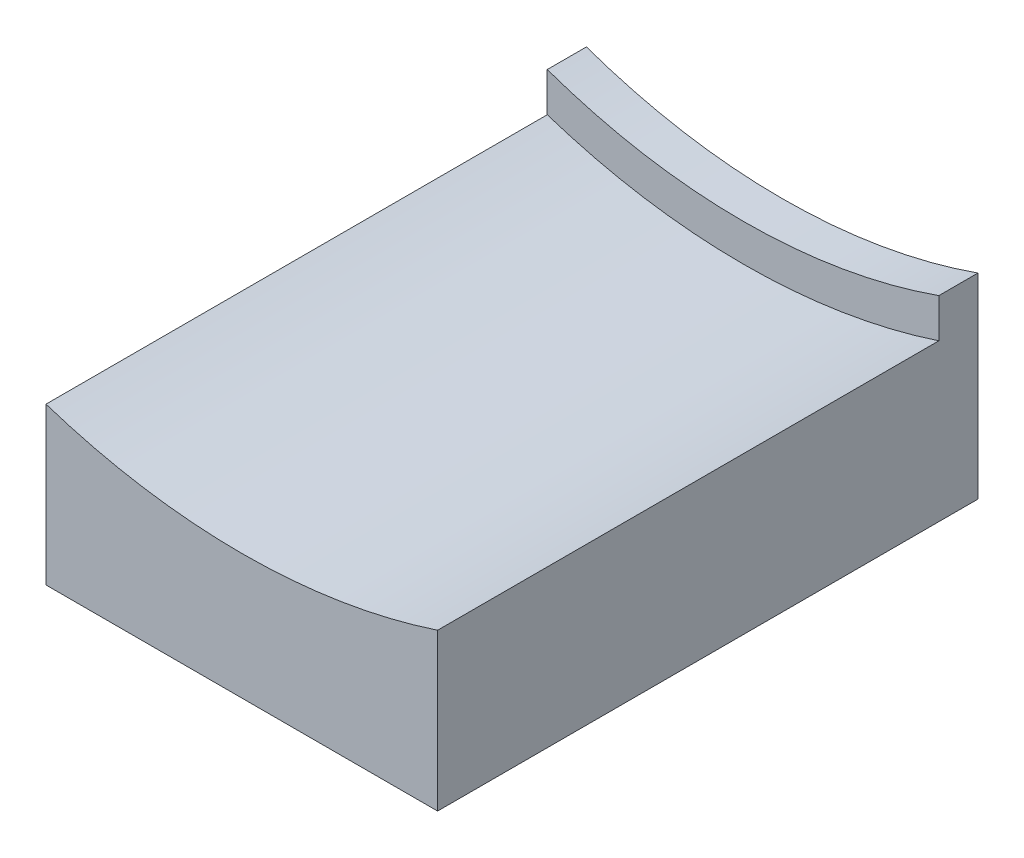
ISO-10303-21;
HEADER;
FILE_DESCRIPTION(('STEP AP214'),'2;1');
FILE_NAME('part.step','',(''),(''),'','','');
FILE_SCHEMA(('AUTOMOTIVE_DESIGN { 1 0 10303 214 1 1 1 1 }'));
ENDSEC;
DATA;
#1=APPLICATION_CONTEXT('core data for automotive mechanical design processes');
#2=APPLICATION_PROTOCOL_DEFINITION('international standard','automotive_design',2000,#1);
#3=PRODUCT_CONTEXT('',#1,'mechanical');
#4=PRODUCT('Part','Part','',(#3));
#5=PRODUCT_RELATED_PRODUCT_CATEGORY('part','',(#4));
#6=PRODUCT_DEFINITION_FORMATION('','',#4);
#7=PRODUCT_DEFINITION_CONTEXT('part definition',#1,'design');
#8=PRODUCT_DEFINITION('design','',#6,#7);
#9=PRODUCT_DEFINITION_SHAPE('','',#8);
#10=(LENGTH_UNIT() NAMED_UNIT(*) SI_UNIT(.MILLI.,.METRE.));
#11=(NAMED_UNIT(*) PLANE_ANGLE_UNIT() SI_UNIT($,.RADIAN.));
#12=(NAMED_UNIT(*) SI_UNIT($,.STERADIAN.) SOLID_ANGLE_UNIT());
#13=UNCERTAINTY_MEASURE_WITH_UNIT(LENGTH_MEASURE(1.E-05),#10,'distance_accuracy_value','');
#14=(GEOMETRIC_REPRESENTATION_CONTEXT(3) GLOBAL_UNCERTAINTY_ASSIGNED_CONTEXT((#13)) GLOBAL_UNIT_ASSIGNED_CONTEXT((#10,
#11,#12)) REPRESENTATION_CONTEXT('',''));
#15=CARTESIAN_POINT('',(0.,0.,0.));
#16=DIRECTION('',(0.,0.,1.));
#17=DIRECTION('',(1.,0.,0.));
#18=AXIS2_PLACEMENT_3D('',#15,#16,#17);
#19=CARTESIAN_POINT('',(0.,0.,64.));
#20=DIRECTION('',(1.,0.,0.));
#21=DIRECTION('',(0.,0.,-1.));
#22=AXIS2_PLACEMENT_3D('',#19,#20,#21);
#23=PLANE('',#22);
#24=DIRECTION('',(0.,0.,-1.));
#25=VECTOR('',#24,1.);
#26=CARTESIAN_POINT('',(0.,20.,64.));
#27=LINE('',#26,#25);
#28=CARTESIAN_POINT('',(0.,20.,64.));
#29=VERTEX_POINT('',#28);
#30=CARTESIAN_POINT('',(0.,20.,0.));
#31=VERTEX_POINT('',#30);
#32=EDGE_CURVE('E152',#29,#31,#27,.T.);
#33=ORIENTED_EDGE('',*,*,#32,.T.);
#34=DIRECTION('',(0.,1.,0.));
#35=VECTOR('',#34,1.);
#36=CARTESIAN_POINT('',(0.,0.,0.));
#37=LINE('',#36,#35);
#38=CARTESIAN_POINT('',(0.,25.,0.));
#39=VERTEX_POINT('',#38);
#40=EDGE_CURVE('E121',#31,#39,#37,.T.);
#41=ORIENTED_EDGE('',*,*,#40,.T.);
#42=DIRECTION('',(0.,0.,1.));
#43=VECTOR('',#42,1.);
#44=CARTESIAN_POINT('',(0.,25.,-5.));
#45=LINE('',#44,#43);
#46=CARTESIAN_POINT('',(0.,25.,-5.));
#47=VERTEX_POINT('',#46);
#48=EDGE_CURVE('E137',#47,#39,#45,.T.);
#49=ORIENTED_EDGE('',*,*,#48,.F.);
#50=DIRECTION('',(0.,1.,0.));
#51=VECTOR('',#50,1.);
#52=CARTESIAN_POINT('',(0.,0.,-5.));
#53=LINE('',#52,#51);
#54=CARTESIAN_POINT('',(0.,0.,-5.));
#55=VERTEX_POINT('',#54);
#56=EDGE_CURVE('E111',#55,#47,#53,.T.);
#57=ORIENTED_EDGE('',*,*,#56,.F.);
#58=DIRECTION('',(0.,0.,-1.));
#59=VECTOR('',#58,1.);
#60=CARTESIAN_POINT('',(0.,0.,64.));
#61=LINE('',#60,#59);
#62=CARTESIAN_POINT('',(0.,0.,64.));
#63=VERTEX_POINT('',#62);
#64=EDGE_CURVE('E11',#63,#55,#61,.T.);
#65=ORIENTED_EDGE('',*,*,#64,.F.);
#66=DIRECTION('',(0.,-1.,0.));
#67=VECTOR('',#66,1.);
#68=CARTESIAN_POINT('',(0.,0.,64.));
#69=LINE('',#68,#67);
#70=EDGE_CURVE('E142',#29,#63,#69,.T.);
#71=ORIENTED_EDGE('',*,*,#70,.F.);
#72=EDGE_LOOP('',(#33,#41,#49,#57,#65,#71));
#73=FACE_BOUND('',#72,.T.);
#74=ADVANCED_FACE('F45',(#73),#23,.F.);
#75=CARTESIAN_POINT('',(0.,0.,64.));
#76=DIRECTION('',(0.,1.,0.));
#77=DIRECTION('',(0.,0.,1.));
#78=AXIS2_PLACEMENT_3D('',#75,#76,#77);
#79=PLANE('',#78);
#80=ORIENTED_EDGE('',*,*,#64,.T.);
#81=DIRECTION('',(-1.,0.,0.));
#82=VECTOR('',#81,1.);
#83=CARTESIAN_POINT('',(50.,0.,-5.));
#84=LINE('',#83,#82);
#85=CARTESIAN_POINT('',(50.,0.,-5.));
#86=VERTEX_POINT('',#85);
#87=EDGE_CURVE('E105',#86,#55,#84,.T.);
#88=ORIENTED_EDGE('',*,*,#87,.F.);
#89=DIRECTION('',(0.,0.,-1.));
#90=VECTOR('',#89,1.);
#91=CARTESIAN_POINT('',(50.,0.,64.));
#92=LINE('',#91,#90);
#93=CARTESIAN_POINT('',(50.,0.,64.));
#94=VERTEX_POINT('',#93);
#95=EDGE_CURVE('E54',#94,#86,#92,.T.);
#96=ORIENTED_EDGE('',*,*,#95,.F.);
#97=DIRECTION('',(1.,0.,0.));
#98=VECTOR('',#97,1.);
#99=CARTESIAN_POINT('',(0.,0.,64.));
#100=LINE('',#99,#98);
#101=EDGE_CURVE('E145',#63,#94,#100,.T.);
#102=ORIENTED_EDGE('',*,*,#101,.F.);
#103=EDGE_LOOP('',(#80,#88,#96,#102));
#104=FACE_BOUND('',#103,.T.);
#105=ADVANCED_FACE('F106',(#104),#79,.F.);
#106=CARTESIAN_POINT('',(50.,0.,64.));
#107=DIRECTION('',(-1.,0.,0.));
#108=DIRECTION('',(0.,0.,1.));
#109=AXIS2_PLACEMENT_3D('',#106,#107,#108);
#110=PLANE('',#109);
#111=ORIENTED_EDGE('',*,*,#95,.T.);
#112=DIRECTION('',(0.,-1.,0.));
#113=VECTOR('',#112,1.);
#114=CARTESIAN_POINT('',(50.,0.,-5.));
#115=LINE('',#114,#113);
#116=CARTESIAN_POINT('',(50.,25.,-5.));
#117=VERTEX_POINT('',#116);
#118=EDGE_CURVE('E98',#117,#86,#115,.T.);
#119=ORIENTED_EDGE('',*,*,#118,.F.);
#120=DIRECTION('',(0.,0.,1.));
#121=VECTOR('',#120,1.);
#122=CARTESIAN_POINT('',(50.,25.,-5.));
#123=LINE('',#122,#121);
#124=CARTESIAN_POINT('',(50.,25.,0.));
#125=VERTEX_POINT('',#124);
#126=EDGE_CURVE('E128',#117,#125,#123,.T.);
#127=ORIENTED_EDGE('',*,*,#126,.T.);
#128=DIRECTION('',(0.,-1.,0.));
#129=VECTOR('',#128,1.);
#130=CARTESIAN_POINT('',(50.,0.,0.));
#131=LINE('',#130,#129);
#132=CARTESIAN_POINT('',(50.,20.,0.));
#133=VERTEX_POINT('',#132);
#134=EDGE_CURVE('E129',#125,#133,#131,.T.);
#135=ORIENTED_EDGE('',*,*,#134,.T.);
#136=DIRECTION('',(0.,0.,-1.));
#137=VECTOR('',#136,1.);
#138=CARTESIAN_POINT('',(50.,20.,64.));
#139=LINE('',#138,#137);
#140=CARTESIAN_POINT('',(50.,20.,64.));
#141=VERTEX_POINT('',#140);
#142=EDGE_CURVE('E103',#141,#133,#139,.T.);
#143=ORIENTED_EDGE('',*,*,#142,.F.);
#144=DIRECTION('',(0.,1.,0.));
#145=VECTOR('',#144,1.);
#146=CARTESIAN_POINT('',(50.,0.,64.));
#147=LINE('',#146,#145);
#148=EDGE_CURVE('E100',#94,#141,#147,.T.);
#149=ORIENTED_EDGE('',*,*,#148,.F.);
#150=EDGE_LOOP('',(#111,#119,#127,#135,#143,#149));
#151=FACE_BOUND('',#150,.T.);
#152=ADVANCED_FACE('F95',(#151),#110,.F.);
#153=CARTESIAN_POINT('',(25.,95.9934207678533,64.));
#154=DIRECTION('',(0.,0.,-1.));
#155=DIRECTION('',(-1.,0.,0.));
#156=AXIS2_PLACEMENT_3D('',#153,#154,#155);
#157=CYLINDRICAL_SURFACE('',#156,80.);
#158=CARTESIAN_POINT('',(25.,95.9934207678533,0.));
#159=DIRECTION('',(0.,0.,-1.));
#160=DIRECTION('',(1.,0.,0.));
#161=AXIS2_PLACEMENT_3D('',#158,#159,#160);
#162=CIRCLE('',#161,80.);
#163=EDGE_CURVE('E141',#133,#31,#162,.T.);
#164=ORIENTED_EDGE('',*,*,#163,.T.);
#165=ORIENTED_EDGE('',*,*,#32,.F.);
#166=CARTESIAN_POINT('',(25.,95.9934207678533,64.));
#167=DIRECTION('',(0.,0.,-1.));
#168=DIRECTION('',(1.,0.,0.));
#169=AXIS2_PLACEMENT_3D('',#166,#167,#168);
#170=CIRCLE('',#169,80.);
#171=EDGE_CURVE('E61',#141,#29,#170,.T.);
#172=ORIENTED_EDGE('',*,*,#171,.F.);
#173=ORIENTED_EDGE('',*,*,#142,.T.);
#174=EDGE_LOOP('',(#164,#165,#172,#173));
#175=FACE_BOUND('',#174,.T.);
#176=ADVANCED_FACE('F162',(#175),#157,.F.);
#177=CARTESIAN_POINT('',(25.,95.9934207678533,64.));
#178=DIRECTION('',(0.,0.,1.));
#179=DIRECTION('',(1.,0.,0.));
#180=AXIS2_PLACEMENT_3D('',#177,#178,#179);
#181=PLANE('',#180);
#182=ORIENTED_EDGE('',*,*,#70,.T.);
#183=ORIENTED_EDGE('',*,*,#101,.T.);
#184=ORIENTED_EDGE('',*,*,#148,.T.);
#185=ORIENTED_EDGE('',*,*,#171,.T.);
#186=EDGE_LOOP('',(#182,#183,#184,#185));
#187=FACE_BOUND('',#186,.T.);
#188=ADVANCED_FACE('F180',(#187),#181,.T.);
#189=CARTESIAN_POINT('',(25.,95.9934207678533,0.));
#190=DIRECTION('',(0.,0.,-1.));
#191=DIRECTION('',(-1.,0.,0.));
#192=AXIS2_PLACEMENT_3D('',#189,#190,#191);
#193=PLANE('',#192);
#194=ORIENTED_EDGE('',*,*,#163,.F.);
#195=ORIENTED_EDGE('',*,*,#134,.F.);
#196=CARTESIAN_POINT('',(25.,95.9934207678533,0.));
#197=DIRECTION('',(0.,0.,1.));
#198=DIRECTION('',(-1.,0.,0.));
#199=AXIS2_PLACEMENT_3D('',#196,#197,#198);
#200=CIRCLE('',#199,75.2666313336891);
#201=EDGE_CURVE('E118',#39,#125,#200,.T.);
#202=ORIENTED_EDGE('',*,*,#201,.F.);
#203=ORIENTED_EDGE('',*,*,#40,.F.);
#204=EDGE_LOOP('',(#194,#195,#202,#203));
#205=FACE_BOUND('',#204,.T.);
#206=ADVANCED_FACE('F166',(#205),#193,.F.);
#207=CARTESIAN_POINT('',(25.,95.9934207678533,-5.));
#208=DIRECTION('',(0.,0.,1.));
#209=DIRECTION('',(1.,0.,0.));
#210=AXIS2_PLACEMENT_3D('',#207,#208,#209);
#211=CYLINDRICAL_SURFACE('',#210,75.2666313336891);
#212=ORIENTED_EDGE('',*,*,#201,.T.);
#213=ORIENTED_EDGE('',*,*,#126,.F.);
#214=CARTESIAN_POINT('',(25.,95.9934207678533,-5.));
#215=DIRECTION('',(0.,0.,1.));
#216=DIRECTION('',(-1.,0.,0.));
#217=AXIS2_PLACEMENT_3D('',#214,#215,#216);
#218=CIRCLE('',#217,75.2666313336891);
#219=EDGE_CURVE('E115',#47,#117,#218,.T.);
#220=ORIENTED_EDGE('',*,*,#219,.F.);
#221=ORIENTED_EDGE('',*,*,#48,.T.);
#222=EDGE_LOOP('',(#212,#213,#220,#221));
#223=FACE_BOUND('',#222,.T.);
#224=ADVANCED_FACE('F172',(#223),#211,.F.);
#225=CARTESIAN_POINT('',(25.,95.9934207678533,-5.));
#226=DIRECTION('',(0.,0.,-1.));
#227=DIRECTION('',(-1.,0.,0.));
#228=AXIS2_PLACEMENT_3D('',#225,#226,#227);
#229=PLANE('',#228);
#230=ORIENTED_EDGE('',*,*,#118,.T.);
#231=ORIENTED_EDGE('',*,*,#87,.T.);
#232=ORIENTED_EDGE('',*,*,#56,.T.);
#233=ORIENTED_EDGE('',*,*,#219,.T.);
#234=EDGE_LOOP('',(#230,#231,#232,#233));
#235=FACE_BOUND('',#234,.T.);
#236=ADVANCED_FACE('F113',(#235),#229,.T.);
#237=CLOSED_SHELL('',(#74,#105,#152,#176,#188,#206,#224,#236));
#238=MANIFOLD_SOLID_BREP('B2',#237);
#239=ADVANCED_BREP_SHAPE_REPRESENTATION('',(#18,#238),#14);
#240=SHAPE_DEFINITION_REPRESENTATION(#9,#239);
ENDSEC;
END-ISO-10303-21;
